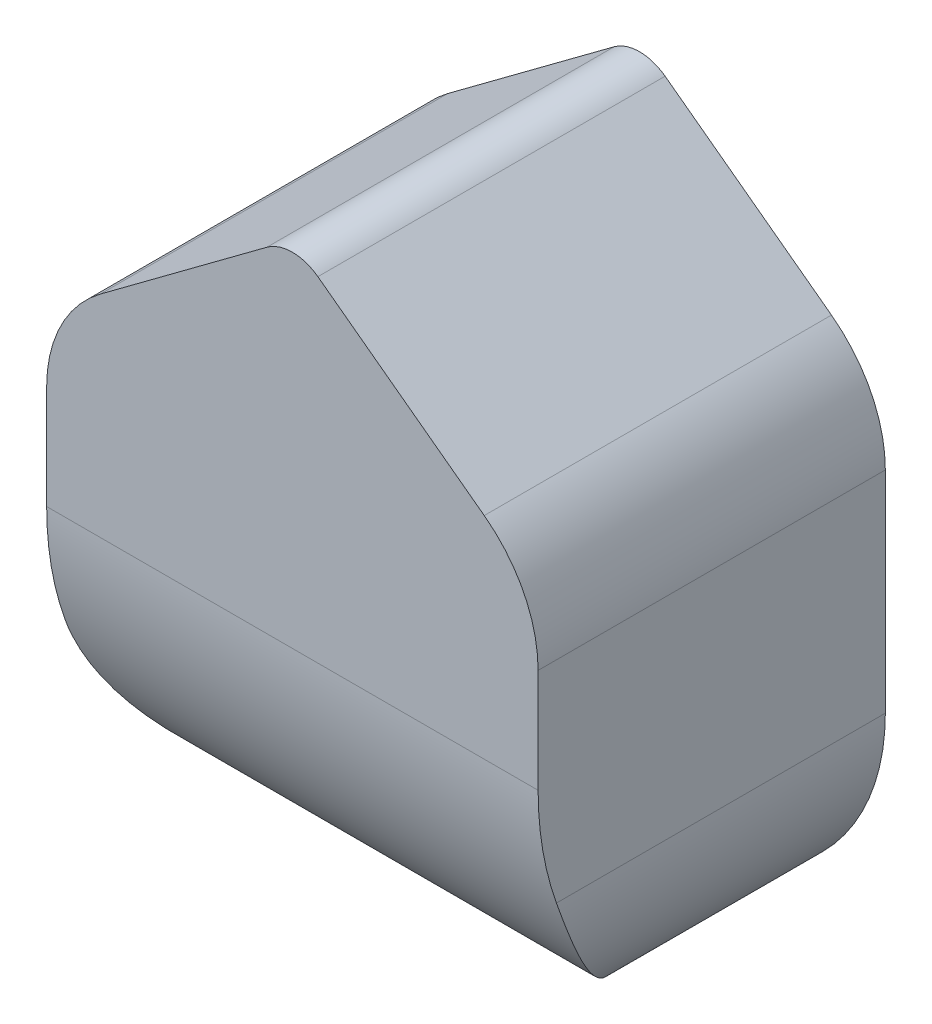
ISO-10303-21;
HEADER;
FILE_DESCRIPTION(('STEP AP214'),'2;1');
FILE_NAME('part.step','',(''),(''),'','','');
FILE_SCHEMA(('AUTOMOTIVE_DESIGN { 1 0 10303 214 1 1 1 1 }'));
ENDSEC;
DATA;
#1=APPLICATION_CONTEXT('core data for automotive mechanical design processes');
#2=APPLICATION_PROTOCOL_DEFINITION('international standard','automotive_design',2000,#1);
#3=PRODUCT_CONTEXT('',#1,'mechanical');
#4=PRODUCT('Part','Part','',(#3));
#5=PRODUCT_RELATED_PRODUCT_CATEGORY('part','',(#4));
#6=PRODUCT_DEFINITION_FORMATION('','',#4);
#7=PRODUCT_DEFINITION_CONTEXT('part definition',#1,'design');
#8=PRODUCT_DEFINITION('design','',#6,#7);
#9=PRODUCT_DEFINITION_SHAPE('','',#8);
#10=(LENGTH_UNIT() NAMED_UNIT(*) SI_UNIT(.MILLI.,.METRE.));
#11=(NAMED_UNIT(*) PLANE_ANGLE_UNIT() SI_UNIT($,.RADIAN.));
#12=(NAMED_UNIT(*) SI_UNIT($,.STERADIAN.) SOLID_ANGLE_UNIT());
#13=UNCERTAINTY_MEASURE_WITH_UNIT(LENGTH_MEASURE(1.E-05),#10,'distance_accuracy_value','');
#14=(GEOMETRIC_REPRESENTATION_CONTEXT(3) GLOBAL_UNCERTAINTY_ASSIGNED_CONTEXT((#13)) GLOBAL_UNIT_ASSIGNED_CONTEXT((#10,
#11,#12)) REPRESENTATION_CONTEXT('',''));
#15=CARTESIAN_POINT('',(0.,0.,0.));
#16=DIRECTION('',(0.,0.,1.));
#17=DIRECTION('',(1.,0.,0.));
#18=AXIS2_PLACEMENT_3D('',#15,#16,#17);
#19=CARTESIAN_POINT('',(0.,15.0430072601773,8.));
#20=DIRECTION('',(0.,-1.,0.));
#21=DIRECTION('',(0.,0.,-1.));
#22=AXIS2_PLACEMENT_3D('',#19,#20,#21);
#23=PLANE('',#22);
#24=DIRECTION('',(-1.,0.,0.));
#25=VECTOR('',#24,1.);
#26=CARTESIAN_POINT('',(0.,15.0430072601773,8.));
#27=LINE('',#26,#25);
#28=CARTESIAN_POINT('',(6.92261617752476,15.0430072601773,8.));
#29=VERTEX_POINT('',#28);
#30=CARTESIAN_POINT('',(1.46020735493172,15.0430072601773,8.));
#31=VERTEX_POINT('',#30);
#32=EDGE_CURVE('E259',#29,#31,#27,.T.);
#33=ORIENTED_EDGE('',*,*,#32,.F.);
#34=DIRECTION('',(0.,0.,-1.));
#35=VECTOR('',#34,1.);
#36=CARTESIAN_POINT('',(6.92261617752476,15.0430072601773,8.));
#37=LINE('',#36,#35);
#38=CARTESIAN_POINT('',(6.92261617752476,15.0430072601773,0.));
#39=VERTEX_POINT('',#38);
#40=EDGE_CURVE('E225',#29,#39,#37,.T.);
#41=ORIENTED_EDGE('',*,*,#40,.T.);
#42=DIRECTION('',(-1.,0.,0.));
#43=VECTOR('',#42,1.);
#44=CARTESIAN_POINT('',(0.,15.0430072601773,0.));
#45=LINE('',#44,#43);
#46=CARTESIAN_POINT('',(1.46020735493172,15.0430072601773,0.));
#47=VERTEX_POINT('',#46);
#48=EDGE_CURVE('E275',#39,#47,#45,.T.);
#49=ORIENTED_EDGE('',*,*,#48,.T.);
#50=DIRECTION('',(0.,0.,-1.));
#51=VECTOR('',#50,1.);
#52=CARTESIAN_POINT('',(1.46020735493172,15.0430072601773,8.));
#53=LINE('',#52,#51);
#54=EDGE_CURVE('E295',#31,#47,#53,.T.);
#55=ORIENTED_EDGE('',*,*,#54,.F.);
#56=EDGE_LOOP('',(#33,#41,#49,#55));
#57=FACE_BOUND('',#56,.T.);
#58=ADVANCED_FACE('F33',(#57),#23,.F.);
#59=CARTESIAN_POINT('',(9.2,7.64,8.));
#60=DIRECTION('',(0.,0.,-1.));
#61=DIRECTION('',(-1.,0.,0.));
#62=AXIS2_PLACEMENT_3D('',#59,#60,#61);
#63=CYLINDRICAL_SURFACE('',#62,4.71680323764082);
#64=CARTESIAN_POINT('',(9.2,7.64,0.));
#65=DIRECTION('',(0.,0.,-1.));
#66=DIRECTION('',(-1.,0.,0.));
#67=AXIS2_PLACEMENT_3D('',#64,#65,#66);
#68=CIRCLE('',#67,4.71680323764082);
#69=CARTESIAN_POINT('',(4.7810325419261,9.28953308154244,0.));
#70=VERTEX_POINT('',#69);
#71=CARTESIAN_POINT('',(6.92261617752476,11.7705878162493,0.));
#72=VERTEX_POINT('',#71);
#73=EDGE_CURVE('E237',#70,#72,#68,.T.);
#74=ORIENTED_EDGE('',*,*,#73,.T.);
#75=DIRECTION('',(0.,0.,-1.));
#76=VECTOR('',#75,1.);
#77=CARTESIAN_POINT('',(6.92261617752476,11.7705878162493,8.));
#78=LINE('',#77,#76);
#79=CARTESIAN_POINT('',(6.92261617752476,11.7705878162493,8.));
#80=VERTEX_POINT('',#79);
#81=EDGE_CURVE('E222',#80,#72,#78,.T.);
#82=ORIENTED_EDGE('',*,*,#81,.F.);
#83=CARTESIAN_POINT('',(9.2,7.64,8.));
#84=DIRECTION('',(0.,0.,-1.));
#85=DIRECTION('',(-1.,0.,0.));
#86=AXIS2_PLACEMENT_3D('',#83,#84,#85);
#87=CIRCLE('',#86,4.71680323764082);
#88=CARTESIAN_POINT('',(4.7810325419261,9.28953308154244,8.));
#89=VERTEX_POINT('',#88);
#90=EDGE_CURVE('E234',#89,#80,#87,.T.);
#91=ORIENTED_EDGE('',*,*,#90,.F.);
#92=DIRECTION('',(0.,0.,-1.));
#93=VECTOR('',#92,1.);
#94=CARTESIAN_POINT('',(4.7810325419261,9.28953308154244,8.));
#95=LINE('',#94,#93);
#96=EDGE_CURVE('E247',#89,#70,#95,.T.);
#97=ORIENTED_EDGE('',*,*,#96,.T.);
#98=EDGE_LOOP('',(#74,#82,#91,#97));
#99=FACE_BOUND('',#98,.T.);
#100=ADVANCED_FACE('F233',(#99),#63,.F.);
#101=CARTESIAN_POINT('',(0.,9.28953308154244,8.));
#102=DIRECTION('',(0.,-1.,0.));
#103=DIRECTION('',(0.,0.,-1.));
#104=AXIS2_PLACEMENT_3D('',#101,#102,#103);
#105=PLANE('',#104);
#106=ORIENTED_EDGE('',*,*,#96,.F.);
#107=DIRECTION('',(-1.,0.,0.));
#108=VECTOR('',#107,1.);
#109=CARTESIAN_POINT('',(0.,9.28953308154244,8.));
#110=LINE('',#109,#108);
#111=CARTESIAN_POINT('',(1.46020735493172,9.28953308154244,8.));
#112=VERTEX_POINT('',#111);
#113=EDGE_CURVE('E244',#89,#112,#110,.T.);
#114=ORIENTED_EDGE('',*,*,#113,.T.);
#115=DIRECTION('',(0.,0.,-1.));
#116=VECTOR('',#115,1.);
#117=CARTESIAN_POINT('',(1.46020735493172,9.28953308154244,8.));
#118=LINE('',#117,#116);
#119=CARTESIAN_POINT('',(1.46020735493172,9.28953308154244,0.));
#120=VERTEX_POINT('',#119);
#121=EDGE_CURVE('E276',#112,#120,#118,.T.);
#122=ORIENTED_EDGE('',*,*,#121,.T.);
#123=DIRECTION('',(-1.,0.,0.));
#124=VECTOR('',#123,1.);
#125=CARTESIAN_POINT('',(0.,9.28953308154244,0.));
#126=LINE('',#125,#124);
#127=EDGE_CURVE('E255',#70,#120,#126,.T.);
#128=ORIENTED_EDGE('',*,*,#127,.F.);
#129=EDGE_LOOP('',(#106,#114,#122,#128));
#130=FACE_BOUND('',#129,.T.);
#131=ADVANCED_FACE('F509',(#130),#105,.T.);
#132=CARTESIAN_POINT('',(13.4,15.886901908671,0.));
#133=DIRECTION('',(0.,0.,1.));
#134=DIRECTION('',(1.,0.,0.));
#135=AXIS2_PLACEMENT_3D('',#132,#133,#134);
#136=PLANE('',#135);
#137=CARTESIAN_POINT('',(13.4,15.886901908671,0.));
#138=DIRECTION('',(0.,0.,1.));
#139=DIRECTION('',(1.,0.,0.));
#140=AXIS2_PLACEMENT_3D('',#137,#138,#139);
#141=CIRCLE('',#140,5.);
#142=CARTESIAN_POINT('',(18.4,15.886901908671,0.));
#143=VERTEX_POINT('',#142);
#144=CARTESIAN_POINT('',(16.3832257694935,19.8994277974635,0.));
#145=VERTEX_POINT('',#144);
#146=EDGE_CURVE('E342',#143,#145,#141,.T.);
#147=ORIENTED_EDGE('',*,*,#146,.F.);
#148=DIRECTION('',(0.,1.,0.));
#149=VECTOR('',#148,1.);
#150=CARTESIAN_POINT('',(18.4,8.00000000000006,0.));
#151=LINE('',#150,#149);
#152=CARTESIAN_POINT('',(18.4,8.00000000000006,0.));
#153=VERTEX_POINT('',#152);
#154=EDGE_CURVE('E347',#153,#143,#151,.T.);
#155=ORIENTED_EDGE('',*,*,#154,.F.);
#156=CARTESIAN_POINT('',(10.4,8.,0.));
#157=DIRECTION('',(0.,0.,1.));
#158=DIRECTION('',(1.,0.,0.));
#159=AXIS2_PLACEMENT_3D('',#156,#157,#158);
#160=CIRCLE('',#159,8.);
#161=CARTESIAN_POINT('',(10.3999999999999,0.,0.));
#162=VERTEX_POINT('',#161);
#163=EDGE_CURVE('E380',#162,#153,#160,.T.);
#164=ORIENTED_EDGE('',*,*,#163,.F.);
#165=DIRECTION('',(1.,0.,0.));
#166=VECTOR('',#165,1.);
#167=CARTESIAN_POINT('',(8.00000000000006,0.,0.));
#168=LINE('',#167,#166);
#169=CARTESIAN_POINT('',(8.00000000000006,0.,0.));
#170=VERTEX_POINT('',#169);
#171=EDGE_CURVE('E377',#170,#162,#168,.T.);
#172=ORIENTED_EDGE('',*,*,#171,.F.);
#173=CARTESIAN_POINT('',(8.,8.,0.));
#174=DIRECTION('',(0.,0.,1.));
#175=DIRECTION('',(-1.,0.,0.));
#176=AXIS2_PLACEMENT_3D('',#173,#174,#175);
#177=CIRCLE('',#176,8.);
#178=CARTESIAN_POINT('',(0.,8.,0.));
#179=VERTEX_POINT('',#178);
#180=EDGE_CURVE('E374',#179,#170,#177,.T.);
#181=ORIENTED_EDGE('',*,*,#180,.F.);
#182=DIRECTION('',(0.,-1.,0.));
#183=VECTOR('',#182,1.);
#184=CARTESIAN_POINT('',(0.,15.886901908671,0.));
#185=LINE('',#184,#183);
#186=CARTESIAN_POINT('',(0.,15.886901908671,0.));
#187=VERTEX_POINT('',#186);
#188=EDGE_CURVE('E371',#187,#179,#185,.T.);
#189=ORIENTED_EDGE('',*,*,#188,.F.);
#190=CARTESIAN_POINT('',(5.,15.886901908671,0.));
#191=DIRECTION('',(0.,0.,1.));
#192=DIRECTION('',(-1.,0.,0.));
#193=AXIS2_PLACEMENT_3D('',#190,#191,#192);
#194=CIRCLE('',#193,5.);
#195=CARTESIAN_POINT('',(2.01677423050649,19.8994277974635,0.));
#196=VERTEX_POINT('',#195);
#197=EDGE_CURVE('E369',#196,#187,#194,.T.);
#198=ORIENTED_EDGE('',*,*,#197,.F.);
#199=DIRECTION('',(-0.802505177758493,-0.596645153898706,0.));
#200=VECTOR('',#199,1.);
#201=CARTESIAN_POINT('',(2.01677423050649,19.8994277974635,0.));
#202=LINE('',#201,#200);
#203=CARTESIAN_POINT('',(8.24536775376207,24.530251677797,0.));
#204=VERTEX_POINT('',#203);
#205=EDGE_CURVE('E367',#204,#196,#202,.T.);
#206=ORIENTED_EDGE('',*,*,#205,.F.);
#207=CARTESIAN_POINT('',(9.2,23.2462433933834,0.));
#208=DIRECTION('',(0.,0.,1.));
#209=DIRECTION('',(-1.,0.,0.));
#210=AXIS2_PLACEMENT_3D('',#207,#208,#209);
#211=CIRCLE('',#210,1.6);
#212=CARTESIAN_POINT('',(10.1546322462379,24.530251677797,0.));
#213=VERTEX_POINT('',#212);
#214=EDGE_CURVE('E365',#213,#204,#211,.T.);
#215=ORIENTED_EDGE('',*,*,#214,.F.);
#216=DIRECTION('',(-0.802505177758493,0.596645153898706,0.));
#217=VECTOR('',#216,1.);
#218=CARTESIAN_POINT('',(10.1546322462379,24.530251677797,0.));
#219=LINE('',#218,#217);
#220=EDGE_CURVE('E363',#145,#213,#219,.T.);
#221=ORIENTED_EDGE('',*,*,#220,.F.);
#222=EDGE_LOOP('',(#147,#155,#164,#172,#181,#189,#198,#206,#215,#221));
#223=FACE_BOUND('',#222,.T.);
#224=ORIENTED_EDGE('',*,*,#48,.F.);
#225=DIRECTION('',(0.,1.,0.));
#226=VECTOR('',#225,1.);
#227=CARTESIAN_POINT('',(6.92261617752476,15.3841818994494,0.));
#228=LINE('',#227,#226);
#229=EDGE_CURVE('E532',#72,#39,#228,.T.);
#230=ORIENTED_EDGE('',*,*,#229,.F.);
#231=ORIENTED_EDGE('',*,*,#73,.F.);
#232=ORIENTED_EDGE('',*,*,#127,.T.);
#233=DIRECTION('',(0.,1.,0.));
#234=VECTOR('',#233,1.);
#235=CARTESIAN_POINT('',(1.46020735493172,0.,0.));
#236=LINE('',#235,#234);
#237=CARTESIAN_POINT('',(1.46020735493172,5.21415553834277,0.));
#238=VERTEX_POINT('',#237);
#239=EDGE_CURVE('E325',#238,#120,#236,.T.);
#240=ORIENTED_EDGE('',*,*,#239,.F.);
#241=DIRECTION('',(-0.873427097958087,0.486954930719995,0.));
#242=VECTOR('',#241,1.);
#243=CARTESIAN_POINT('',(2.56393453633565,4.59880321596713,0.));
#244=LINE('',#243,#242);
#245=CARTESIAN_POINT('',(9.2,0.899049904366653,0.));
#246=VERTEX_POINT('',#245);
#247=EDGE_CURVE('E322',#246,#238,#244,.T.);
#248=ORIENTED_EDGE('',*,*,#247,.F.);
#249=DIRECTION('',(-0.873427097958086,-0.486954930719995,0.));
#250=VECTOR('',#249,1.);
#251=CARTESIAN_POINT('',(1.79916738743063,-3.22707801237557,0.));
#252=LINE('',#251,#250);
#253=CARTESIAN_POINT('',(16.9397926450683,5.21415553834277,0.));
#254=VERTEX_POINT('',#253);
#255=EDGE_CURVE('E319',#254,#246,#252,.T.);
#256=ORIENTED_EDGE('',*,*,#255,.F.);
#257=DIRECTION('',(0.,-1.,0.));
#258=VECTOR('',#257,1.);
#259=CARTESIAN_POINT('',(16.9397926450683,0.,0.));
#260=LINE('',#259,#258);
#261=CARTESIAN_POINT('',(16.9397926450683,9.28953308154244,0.));
#262=VERTEX_POINT('',#261);
#263=EDGE_CURVE('E316',#262,#254,#260,.T.);
#264=ORIENTED_EDGE('',*,*,#263,.F.);
#265=CARTESIAN_POINT('',(13.6189674580739,9.28953308154244,0.));
#266=VERTEX_POINT('',#265);
#267=EDGE_CURVE('E313',#262,#266,#126,.T.);
#268=ORIENTED_EDGE('',*,*,#267,.T.);
#269=CARTESIAN_POINT('',(11.4773838224752,11.7705878162493,0.));
#270=VERTEX_POINT('',#269);
#271=EDGE_CURVE('E252',#270,#266,#68,.T.);
#272=ORIENTED_EDGE('',*,*,#271,.F.);
#273=DIRECTION('',(0.,-1.,0.));
#274=VECTOR('',#273,1.);
#275=CARTESIAN_POINT('',(11.4773838224752,15.3841818994494,0.));
#276=LINE('',#275,#274);
#277=CARTESIAN_POINT('',(11.4773838224752,15.0430072601773,0.));
#278=VERTEX_POINT('',#277);
#279=EDGE_CURVE('E229',#278,#270,#276,.T.);
#280=ORIENTED_EDGE('',*,*,#279,.F.);
#281=CARTESIAN_POINT('',(16.9397926450683,15.0430072601773,0.));
#282=VERTEX_POINT('',#281);
#283=EDGE_CURVE('E277',#282,#278,#45,.T.);
#284=ORIENTED_EDGE('',*,*,#283,.F.);
#285=DIRECTION('',(0.,-1.,0.));
#286=VECTOR('',#285,1.);
#287=CARTESIAN_POINT('',(16.9397926450683,0.,0.));
#288=LINE('',#287,#286);
#289=CARTESIAN_POINT('',(16.9397926450683,18.1594724402711,0.));
#290=VERTEX_POINT('',#289);
#291=EDGE_CURVE('E273',#290,#282,#288,.T.);
#292=ORIENTED_EDGE('',*,*,#291,.F.);
#293=DIRECTION('',(0.83318290839071,-0.552997505569056,0.));
#294=VECTOR('',#293,1.);
#295=CARTESIAN_POINT('',(13.5472361944007,20.4111691995637,0.));
#296=LINE('',#295,#294);
#297=CARTESIAN_POINT('',(9.2,23.2965029569094,0.));
#298=VERTEX_POINT('',#297);
#299=EDGE_CURVE('E260',#298,#290,#296,.T.);
#300=ORIENTED_EDGE('',*,*,#299,.F.);
#301=DIRECTION('',(0.83318290839071,0.552997505569055,0.));
#302=VECTOR('',#301,1.);
#303=CARTESIAN_POINT('',(-7.92040135695373,11.9334047111436,0.));
#304=LINE('',#303,#302);
#305=CARTESIAN_POINT('',(1.46020735493172,18.1594724402711,0.));
#306=VERTEX_POINT('',#305);
#307=EDGE_CURVE('E283',#306,#298,#304,.T.);
#308=ORIENTED_EDGE('',*,*,#307,.F.);
#309=DIRECTION('',(0.,1.,0.));
#310=VECTOR('',#309,1.);
#311=CARTESIAN_POINT('',(1.46020735493172,0.,0.));
#312=LINE('',#311,#310);
#313=EDGE_CURVE('E280',#47,#306,#312,.T.);
#314=ORIENTED_EDGE('',*,*,#313,.F.);
#315=EDGE_LOOP('',(#224,#230,#231,#232,#240,#248,#256,#264,#268,#272,#280,#284,#292,#300,#308,#314));
#316=FACE_BOUND('',#315,.T.);
#317=ADVANCED_FACE('F469',(#223,#316),#136,.F.);
#318=CARTESIAN_POINT('',(13.4,12.,0.999999999999999));
#319=DIRECTION('',(-1.,0.,0.));
#320=DIRECTION('',(0.,0.,1.));
#321=AXIS2_PLACEMENT_3D('',#318,#319,#320);
#322=CYLINDRICAL_SURFACE('',#321,12.);
#323=CARTESIAN_POINT('',(-10.7112279493106,12.,0.999999999999999));
#324=DIRECTION('',(-0.486954930719995,-0.873427097958087,0.));
#325=DIRECTION('',(-0.873427097958086,0.486954930719995,0.));
#326=AXIS2_PLACEMENT_3D('',#323,#324,#325);
#327=ELLIPSE('',#326,24.6429376580235,12.);
#328=CARTESIAN_POINT('',(6.77111746280706,2.25320565519103,8.));
#329=VERTEX_POINT('',#328);
#330=CARTESIAN_POINT('',(9.2,0.899049904366653,5.55729162708049));
#331=VERTEX_POINT('',#330);
#332=EDGE_CURVE('E340',#329,#331,#327,.F.);
#333=ORIENTED_EDGE('',*,*,#332,.F.);
#334=DIRECTION('',(-1.,0.,0.));
#335=VECTOR('',#334,1.);
#336=CARTESIAN_POINT('',(13.4,2.25320565519103,8.));
#337=LINE('',#336,#335);
#338=CARTESIAN_POINT('',(11.6288825371929,2.25320565519103,8.));
#339=VERTEX_POINT('',#338);
#340=EDGE_CURVE('E11',#329,#339,#337,.F.);
#341=ORIENTED_EDGE('',*,*,#340,.T.);
#342=CARTESIAN_POINT('',(29.1112279493106,12.,0.999999999999999));
#343=DIRECTION('',(0.486954930719995,-0.873427097958086,0.));
#344=DIRECTION('',(-0.873427097958086,-0.486954930719995,0.));
#345=AXIS2_PLACEMENT_3D('',#342,#343,#344);
#346=ELLIPSE('',#345,24.6429376580235,12.);
#347=EDGE_CURVE('E290',#331,#339,#346,.F.);
#348=ORIENTED_EDGE('',*,*,#347,.F.);
#349=EDGE_LOOP('',(#333,#341,#348));
#350=FACE_BOUND('',#349,.T.);
#351=DIRECTION('',(1.,0.,0.));
#352=VECTOR('',#351,1.);
#353=CARTESIAN_POINT('',(13.4,12.,13.));
#354=LINE('',#353,#352);
#355=CARTESIAN_POINT('',(0.,12.,13.));
#356=VERTEX_POINT('',#355);
#357=CARTESIAN_POINT('',(18.4,12.,13.));
#358=VERTEX_POINT('',#357);
#359=EDGE_CURVE('E409',#356,#358,#354,.T.);
#360=ORIENTED_EDGE('',*,*,#359,.F.);
#361=CARTESIAN_POINT('',(0.,12.,0.999999999999999));
#362=DIRECTION('',(1.,0.,0.));
#363=DIRECTION('',(0.,1.,0.));
#364=AXIS2_PLACEMENT_3D('',#361,#362,#363);
#365=CIRCLE('',#364,12.);
#366=CARTESIAN_POINT('',(0.,8.,12.3137084989848));
#367=VERTEX_POINT('',#366);
#368=EDGE_CURVE('E42',#367,#356,#365,.F.);
#369=ORIENTED_EDGE('',*,*,#368,.F.);
#370=CARTESIAN_POINT('',(8.,0.,0.999999999999994));
#371=CARTESIAN_POINT('',(7.99538122695561,2.50438115082193E-09,1.0056568188216));
#372=CARTESIAN_POINT('',(7.99076242370517,4.00238210075459E-06,1.0113136744086));
#373=CARTESIAN_POINT('',(7.63845723717338,0.000614028153834457,1.44279779003448));
#374=CARTESIAN_POINT('',(7.2906242555845,0.0238691152832424,1.8688154183229));
#375=CARTESIAN_POINT('',(6.59807150362606,0.116042783644326,2.71888550356705));
#376=CARTESIAN_POINT('',(6.25335456063913,0.184999296468617,3.14293603319878));
#377=CARTESIAN_POINT('',(5.57006293517,0.369737381878923,3.98732989502775));
#378=CARTESIAN_POINT('',(5.23150223962011,0.485614327151301,4.40766388385967));
#379=CARTESIAN_POINT('',(4.56552401194781,0.765720759717765,5.24075064228316));
#380=CARTESIAN_POINT('',(4.23809973587422,0.929920380658537,5.65350792782798));
#381=CARTESIAN_POINT('',(3.70249967635173,1.24761725551014,6.3365471084129));
#382=CARTESIAN_POINT('',(3.48995335260782,1.38745416110487,6.60980366210154));
#383=CARTESIAN_POINT('',(3.07411657147563,1.69112085546111,7.15004228345396));
#384=CARTESIAN_POINT('',(2.87082591770061,1.85495013484128,7.41702448418871));
#385=CARTESIAN_POINT('',(2.47617755647125,2.20714111952762,7.9426085624446));
#386=CARTESIAN_POINT('',(2.28479888573817,2.39545781564837,8.20122475398117));
#387=CARTESIAN_POINT('',(1.9163868656873,2.79769332155627,8.70858530127832));
#388=CARTESIAN_POINT('',(1.73934929430897,3.01160454996406,8.95733255139909));
#389=CARTESIAN_POINT('',(1.44670970620311,3.4067303757682,9.37951219638362));
#390=CARTESIAN_POINT('',(1.32709246285545,3.58201065578788,9.55572830009674));
#391=CARTESIAN_POINT('',(1.0992154588197,3.94716392022832,9.90027095100729));
#392=CARTESIAN_POINT('',(0.99095517928543,4.13703623732041,10.0685978584304));
#393=CARTESIAN_POINT('',(0.787763737007561,4.53117241458256,10.3958591903217));
#394=CARTESIAN_POINT('',(0.69282126448605,4.73542383955199,10.5548015171331));
#395=CARTESIAN_POINT('',(0.518289080259518,5.15812524534969,10.8618934282103));
#396=CARTESIAN_POINT('',(0.438695909231553,5.37657201205416,11.01004543963));
#397=CARTESIAN_POINT('',(0.311845063608718,5.78024865969523,11.2644649948438));
#398=CARTESIAN_POINT('',(0.26130448519226,5.96298905317116,11.3730527042074));
#399=CARTESIAN_POINT('',(0.172562033916395,6.33626933695993,11.5814848900598));
#400=CARTESIAN_POINT('',(0.134357364362326,6.52680744838642,11.6813313445465));
#401=CARTESIAN_POINT('',(0.0715560402377211,6.91451540789029,11.8712633276666));
#402=CARTESIAN_POINT('',(0.0469383402883149,7.11167449505038,11.9613637772016));
#403=CARTESIAN_POINT('',(0.0124013140751022,7.51160920753289,12.1311053355569));
#404=CARTESIAN_POINT('',(0.0024745807025733,7.71438194990565,12.2107516968008));
#405=CARTESIAN_POINT('',(-0.00166698657798628,8.12486108069892,12.3591850818682));
#406=CARTESIAN_POINT('',(0.00417391925332744,8.33258239209948,12.4279326690026));
#407=CARTESIAN_POINT('',(0.0325209001306191,8.75041701699626,12.553692661359));
#408=CARTESIAN_POINT('',(0.0550257408966633,8.96053015219777,12.6107059353295));
#409=CARTESIAN_POINT('',(0.117538329136434,9.38303014447101,12.7132022489421));
#410=CARTESIAN_POINT('',(0.157699321897933,9.59542065832897,12.758578701998));
#411=CARTESIAN_POINT('',(0.231232940287547,9.91260907318874,12.8175465704628));
#412=CARTESIAN_POINT('',(0.257974628378074,10.01815313702,12.8356925461555));
#413=CARTESIAN_POINT('',(0.315880924422312,10.2285005449097,12.8689987915752));
#414=CARTESIAN_POINT('',(0.347045687367239,10.3333038628761,12.8841589566305));
#415=CARTESIAN_POINT('',(0.380416845387935,10.4376120589528,12.8978545932311));
#416=B_SPLINE_CURVE_WITH_KNOTS('',3,(#370,#371,#372,#373,#374,#375,#376,#377,#378,#379,#380,
#381,#382,#383,#384,#385,#386,#387,#388,#389,#390,#391,#392,#393,#394,#395,#396,#397,#398,#399,
#400,#401,#402,#403,#404,#405,#406,#407,#408,#409,#410,#411,#412,#413,#414,#415),.UNSPECIFIED.,
.F.,.F.,(4,2,2,2,2,2,2,2,2,2,2,2,2,2,2,2,2,2,2,2,2,2,4),(0.,0.0219089055865456,1.67112072310379,
3.32170308220163,4.97565747124117,6.62859175506892,7.74786350337341,8.86711149189854,
9.98433057801761,11.1012195471463,11.9280726176783,12.7548878967222,13.5809967189719,
14.4069191401942,15.0618012045276,15.7165346950303,16.3702511769761,17.0236379460579,
17.6793375063007,18.3349885044322,18.9964461230666,19.3274749204774,19.658515320502),.UNSPECIFIED.);
#417=CARTESIAN_POINT('',(8.00000000000006,0.,0.999999999999997));
#418=VERTEX_POINT('',#417);
#419=EDGE_CURVE('E444',#418,#367,#416,.T.);
#420=ORIENTED_EDGE('',*,*,#419,.F.);
#421=DIRECTION('',(1.,0.,0.));
#422=VECTOR('',#421,1.);
#423=CARTESIAN_POINT('',(13.4,0.,0.999999999999999));
#424=LINE('',#423,#422);
#425=CARTESIAN_POINT('',(10.3999999999999,0.,1.));
#426=VERTEX_POINT('',#425);
#427=EDGE_CURVE('E423',#426,#418,#424,.F.);
#428=ORIENTED_EDGE('',*,*,#427,.F.);
#429=CARTESIAN_POINT('',(18.4,8.00000000000006,12.3137084989848));
#430=CARTESIAN_POINT('',(18.4000010529958,7.88725152338777,12.2738482261777));
#431=CARTESIAN_POINT('',(18.3976161135973,7.77512277413698,12.2323058091683));
#432=CARTESIAN_POINT('',(18.3882430818392,7.55234039805637,12.1459672469286));
#433=CARTESIAN_POINT('',(18.3812557668838,7.44168652531964,12.1011716523414));
#434=CARTESIAN_POINT('',(18.3536742397118,7.11261636595452,11.9622113884956));
#435=CARTESIAN_POINT('',(18.3264592487976,6.8966972807025,11.8633336459753));
#436=CARTESIAN_POINT('',(18.2562585906298,6.47540971948012,11.655214055401));
#437=CARTESIAN_POINT('',(18.2134346367928,6.26995683980785,11.5460867088325));
#438=CARTESIAN_POINT('',(18.1135305601132,5.86826225009446,11.3177133684775));
#439=CARTESIAN_POINT('',(18.0564437205449,5.67202493174679,11.1984626248652));
#440=CARTESIAN_POINT('',(17.9150978010627,5.24600374773862,10.9227874906646));
#441=CARTESIAN_POINT('',(17.8276112806537,5.01876140446632,10.7640832381));
#442=CARTESIAN_POINT('',(17.6361915951927,4.58023201617734,10.4351617868805));
#443=CARTESIAN_POINT('',(17.5322562836741,4.36894705882479,10.2649430873229));
#444=CARTESIAN_POINT('',(17.198489934502,3.75776199036091,9.73815040519433));
#445=CARTESIAN_POINT('',(16.9472687447155,3.38215514204372,9.36651052348747));
#446=CARTESIAN_POINT('',(16.4877384121156,2.80079723623293,8.71383310490017));
#447=CARTESIAN_POINT('',(16.2898316257542,2.57824609813858,8.43988258724113));
#448=CARTESIAN_POINT('',(15.8783654588827,2.16279768949804,7.88117203577637));
#449=CARTESIAN_POINT('',(15.6648003264538,1.96991139741359,7.5964080484682));
#450=CARTESIAN_POINT('',(15.2252210813791,1.61270288172112,7.01828023825002));
#451=CARTESIAN_POINT('',(14.9991948017193,1.44840925037398,6.72490814596327));
#452=CARTESIAN_POINT('',(14.5375568913225,1.14751786646914,6.13168726958051));
#453=CARTESIAN_POINT('',(14.3019458966282,1.01091827972,5.83183891586721));
#454=CARTESIAN_POINT('',(13.7719853856738,0.738002333745983,5.16229130680892));
#455=CARTESIAN_POINT('',(13.4758729476844,0.60802610183671,4.79139953569769));
#456=CARTESIAN_POINT('',(12.8759417359698,0.386063271920366,4.04439422001096));
#457=CARTESIAN_POINT('',(12.5721203988501,0.294089491123075,3.66827895782721));
#458=CARTESIAN_POINT('',(11.9603117448215,0.147345320717247,2.91364279033773));
#459=CARTESIAN_POINT('',(11.65233483902,0.0924950339377045,2.53512883240664));
#460=CARTESIAN_POINT('',(11.0341558093933,0.0191081585270254,1.77668822016056));
#461=CARTESIAN_POINT('',(10.7239551905412,0.000548979871861872,1.39676259223756));
#462=CARTESIAN_POINT('',(10.4092375795799,4.0018575963251E-06,1.01131367837152));
#463=CARTESIAN_POINT('',(10.4046187763309,1.96604067198943E-09,1.00565682278493));
#464=CARTESIAN_POINT('',(10.4,0.,0.999999999999994));
#465=B_SPLINE_CURVE_WITH_KNOTS('',3,(#429,#430,#431,#432,#433,#434,#435,#436,#437,#438,#439,
#440,#441,#442,#443,#444,#445,#446,#447,#448,#449,#450,#451,#452,#453,#454,#455,#456,#457,#458,
#459,#460,#461,#462,#463,#464),.UNSPECIFIED.,.F.,.F.,(4,2,2,2,2,2,2,2,2,2,2,2,2,2,2,2,2,4),(0.,
0.358680711212579,0.717300851873326,1.43329167302744,2.14206619375366,2.8511751241552,
3.72182051738215,4.59257961832493,6.34010279388976,7.55272473642902,8.76579437566227,
9.98007018319371,11.1942655422957,12.6687901822852,14.1438117348278,15.6156485649524,
17.0865689329334,17.10847783852),.UNSPECIFIED.);
#466=CARTESIAN_POINT('',(18.4,8.00000000000006,12.3137084989848));
#467=VERTEX_POINT('',#466);
#468=EDGE_CURVE('E415',#467,#426,#465,.T.);
#469=ORIENTED_EDGE('',*,*,#468,.F.);
#470=CARTESIAN_POINT('',(18.4,12.,0.999999999999999));
#471=DIRECTION('',(-1.,0.,0.));
#472=DIRECTION('',(0.,0.,1.));
#473=AXIS2_PLACEMENT_3D('',#470,#471,#472);
#474=CIRCLE('',#473,12.);
#475=EDGE_CURVE('E412',#358,#467,#474,.F.);
#476=ORIENTED_EDGE('',*,*,#475,.F.);
#477=EDGE_LOOP('',(#360,#369,#420,#428,#469,#476));
#478=FACE_BOUND('',#477,.T.);
#479=ADVANCED_FACE('F35',(#350,#478),#322,.T.);
#480=CARTESIAN_POINT('',(13.4,15.886901908671,13.));
#481=DIRECTION('',(0.,0.,-1.));
#482=DIRECTION('',(-1.,0.,0.));
#483=AXIS2_PLACEMENT_3D('',#480,#481,#482);
#484=CYLINDRICAL_SURFACE('',#483,5.);
#485=ORIENTED_EDGE('',*,*,#146,.T.);
#486=DIRECTION('',(0.,0.,-1.));
#487=VECTOR('',#486,1.);
#488=CARTESIAN_POINT('',(16.3832257694935,19.8994277974635,13.));
#489=LINE('',#488,#487);
#490=CARTESIAN_POINT('',(16.3832257694935,19.8994277974635,13.));
#491=VERTEX_POINT('',#490);
#492=EDGE_CURVE('E406',#491,#145,#489,.T.);
#493=ORIENTED_EDGE('',*,*,#492,.F.);
#494=CARTESIAN_POINT('',(13.4,15.886901908671,13.));
#495=DIRECTION('',(0.,0.,1.));
#496=DIRECTION('',(1.,0.,0.));
#497=AXIS2_PLACEMENT_3D('',#494,#495,#496);
#498=CIRCLE('',#497,5.);
#499=CARTESIAN_POINT('',(18.4,15.886901908671,13.));
#500=VERTEX_POINT('',#499);
#501=EDGE_CURVE('E343',#500,#491,#498,.T.);
#502=ORIENTED_EDGE('',*,*,#501,.F.);
#503=DIRECTION('',(0.,0.,-1.));
#504=VECTOR('',#503,1.);
#505=CARTESIAN_POINT('',(18.4,15.886901908671,13.));
#506=LINE('',#505,#504);
#507=EDGE_CURVE('E360',#500,#143,#506,.T.);
#508=ORIENTED_EDGE('',*,*,#507,.T.);
#509=EDGE_LOOP('',(#485,#493,#502,#508));
#510=FACE_BOUND('',#509,.T.);
#511=ADVANCED_FACE('F485',(#510),#484,.T.);
#512=CARTESIAN_POINT('',(10.1546322462379,24.530251677797,13.));
#513=DIRECTION('',(-0.596645153898706,-0.802505177758492,0.));
#514=DIRECTION('',(0.802505177758493,-0.596645153898706,0.));
#515=AXIS2_PLACEMENT_3D('',#512,#513,#514);
#516=PLANE('',#515);
#517=ORIENTED_EDGE('',*,*,#220,.T.);
#518=DIRECTION('',(0.,0.,-1.));
#519=VECTOR('',#518,1.);
#520=CARTESIAN_POINT('',(10.1546322462379,24.530251677797,13.));
#521=LINE('',#520,#519);
#522=CARTESIAN_POINT('',(10.1546322462379,24.530251677797,13.));
#523=VERTEX_POINT('',#522);
#524=EDGE_CURVE('E403',#523,#213,#521,.T.);
#525=ORIENTED_EDGE('',*,*,#524,.F.);
#526=DIRECTION('',(-0.802505177758493,0.596645153898706,0.));
#527=VECTOR('',#526,1.);
#528=CARTESIAN_POINT('',(10.1546322462379,24.530251677797,13.));
#529=LINE('',#528,#527);
#530=EDGE_CURVE('E346',#491,#523,#529,.T.);
#531=ORIENTED_EDGE('',*,*,#530,.F.);
#532=ORIENTED_EDGE('',*,*,#492,.T.);
#533=EDGE_LOOP('',(#517,#525,#531,#532));
#534=FACE_BOUND('',#533,.T.);
#535=ADVANCED_FACE('F487',(#534),#516,.F.);
#536=CARTESIAN_POINT('',(9.2,23.2462433933834,13.));
#537=DIRECTION('',(0.,0.,-1.));
#538=DIRECTION('',(-1.,0.,0.));
#539=AXIS2_PLACEMENT_3D('',#536,#537,#538);
#540=CYLINDRICAL_SURFACE('',#539,1.6);
#541=ORIENTED_EDGE('',*,*,#214,.T.);
#542=DIRECTION('',(0.,0.,-1.));
#543=VECTOR('',#542,1.);
#544=CARTESIAN_POINT('',(8.24536775376207,24.530251677797,13.));
#545=LINE('',#544,#543);
#546=CARTESIAN_POINT('',(8.24536775376207,24.530251677797,13.));
#547=VERTEX_POINT('',#546);
#548=EDGE_CURVE('E400',#547,#204,#545,.T.);
#549=ORIENTED_EDGE('',*,*,#548,.F.);
#550=CARTESIAN_POINT('',(9.2,23.2462433933834,13.));
#551=DIRECTION('',(0.,0.,1.));
#552=DIRECTION('',(-1.,0.,0.));
#553=AXIS2_PLACEMENT_3D('',#550,#551,#552);
#554=CIRCLE('',#553,1.6);
#555=EDGE_CURVE('E349',#523,#547,#554,.T.);
#556=ORIENTED_EDGE('',*,*,#555,.F.);
#557=ORIENTED_EDGE('',*,*,#524,.T.);
#558=EDGE_LOOP('',(#541,#549,#556,#557));
#559=FACE_BOUND('',#558,.T.);
#560=ADVANCED_FACE('F492',(#559),#540,.T.);
#561=CARTESIAN_POINT('',(2.01677423050649,19.8994277974635,13.));
#562=DIRECTION('',(0.596645153898706,-0.802505177758493,0.));
#563=DIRECTION('',(0.802505177758493,0.596645153898706,0.));
#564=AXIS2_PLACEMENT_3D('',#561,#562,#563);
#565=PLANE('',#564);
#566=ORIENTED_EDGE('',*,*,#205,.T.);
#567=DIRECTION('',(0.,0.,-1.));
#568=VECTOR('',#567,1.);
#569=CARTESIAN_POINT('',(2.01677423050649,19.8994277974635,13.));
#570=LINE('',#569,#568);
#571=CARTESIAN_POINT('',(2.01677423050649,19.8994277974635,13.));
#572=VERTEX_POINT('',#571);
#573=EDGE_CURVE('E397',#572,#196,#570,.T.);
#574=ORIENTED_EDGE('',*,*,#573,.F.);
#575=DIRECTION('',(-0.802505177758493,-0.596645153898706,0.));
#576=VECTOR('',#575,1.);
#577=CARTESIAN_POINT('',(2.01677423050649,19.8994277974635,13.));
#578=LINE('',#577,#576);
#579=EDGE_CURVE('E351',#547,#572,#578,.T.);
#580=ORIENTED_EDGE('',*,*,#579,.F.);
#581=ORIENTED_EDGE('',*,*,#548,.T.);
#582=EDGE_LOOP('',(#566,#574,#580,#581));
#583=FACE_BOUND('',#582,.T.);
#584=ADVANCED_FACE('F494',(#583),#565,.F.);
#585=CARTESIAN_POINT('',(5.,15.886901908671,13.));
#586=DIRECTION('',(0.,0.,-1.));
#587=DIRECTION('',(-1.,0.,0.));
#588=AXIS2_PLACEMENT_3D('',#585,#586,#587);
#589=CYLINDRICAL_SURFACE('',#588,5.);
#590=ORIENTED_EDGE('',*,*,#197,.T.);
#591=DIRECTION('',(0.,0.,-1.));
#592=VECTOR('',#591,1.);
#593=CARTESIAN_POINT('',(0.,15.886901908671,13.));
#594=LINE('',#593,#592);
#595=CARTESIAN_POINT('',(0.,15.886901908671,13.));
#596=VERTEX_POINT('',#595);
#597=EDGE_CURVE('E394',#596,#187,#594,.T.);
#598=ORIENTED_EDGE('',*,*,#597,.F.);
#599=CARTESIAN_POINT('',(5.,15.886901908671,13.));
#600=DIRECTION('',(0.,0.,1.));
#601=DIRECTION('',(-1.,0.,0.));
#602=AXIS2_PLACEMENT_3D('',#599,#600,#601);
#603=CIRCLE('',#602,5.);
#604=EDGE_CURVE('E353',#572,#596,#603,.T.);
#605=ORIENTED_EDGE('',*,*,#604,.F.);
#606=ORIENTED_EDGE('',*,*,#573,.T.);
#607=EDGE_LOOP('',(#590,#598,#605,#606));
#608=FACE_BOUND('',#607,.T.);
#609=ADVANCED_FACE('F463',(#608),#589,.T.);
#610=CARTESIAN_POINT('',(0.,15.886901908671,13.));
#611=DIRECTION('',(1.,0.,0.));
#612=DIRECTION('',(0.,1.,0.));
#613=AXIS2_PLACEMENT_3D('',#610,#611,#612);
#614=PLANE('',#613);
#615=DIRECTION('',(0.,0.,-1.));
#616=VECTOR('',#615,1.);
#617=CARTESIAN_POINT('',(0.,8.,13.));
#618=LINE('',#617,#616);
#619=EDGE_CURVE('E392',#367,#179,#618,.T.);
#620=ORIENTED_EDGE('',*,*,#619,.F.);
#621=ORIENTED_EDGE('',*,*,#368,.T.);
#622=DIRECTION('',(0.,-1.,0.));
#623=VECTOR('',#622,1.);
#624=CARTESIAN_POINT('',(0.,15.886901908671,13.));
#625=LINE('',#624,#623);
#626=EDGE_CURVE('E355',#596,#356,#625,.T.);
#627=ORIENTED_EDGE('',*,*,#626,.F.);
#628=ORIENTED_EDGE('',*,*,#597,.T.);
#629=ORIENTED_EDGE('',*,*,#188,.T.);
#630=EDGE_LOOP('',(#620,#621,#627,#628,#629));
#631=FACE_BOUND('',#630,.T.);
#632=ADVANCED_FACE('F441',(#631),#614,.F.);
#633=CARTESIAN_POINT('',(8.,8.,13.));
#634=DIRECTION('',(0.,0.,-1.));
#635=DIRECTION('',(-1.,0.,0.));
#636=AXIS2_PLACEMENT_3D('',#633,#634,#635);
#637=CYLINDRICAL_SURFACE('',#636,8.);
#638=DIRECTION('',(0.,0.,-1.));
#639=VECTOR('',#638,1.);
#640=CARTESIAN_POINT('',(8.00000000000006,0.,13.));
#641=LINE('',#640,#639);
#642=EDGE_CURVE('E390',#418,#170,#641,.T.);
#643=ORIENTED_EDGE('',*,*,#642,.F.);
#644=ORIENTED_EDGE('',*,*,#419,.T.);
#645=ORIENTED_EDGE('',*,*,#619,.T.);
#646=ORIENTED_EDGE('',*,*,#180,.T.);
#647=EDGE_LOOP('',(#643,#644,#645,#646));
#648=FACE_BOUND('',#647,.T.);
#649=ADVANCED_FACE('F436',(#648),#637,.T.);
#650=CARTESIAN_POINT('',(8.00000000000006,0.,13.));
#651=DIRECTION('',(0.,1.,0.));
#652=DIRECTION('',(0.,0.,1.));
#653=AXIS2_PLACEMENT_3D('',#650,#651,#652);
#654=PLANE('',#653);
#655=DIRECTION('',(0.,0.,-1.));
#656=VECTOR('',#655,1.);
#657=CARTESIAN_POINT('',(10.3999999999999,0.,13.));
#658=LINE('',#657,#656);
#659=EDGE_CURVE('E388',#426,#162,#658,.T.);
#660=ORIENTED_EDGE('',*,*,#659,.F.);
#661=ORIENTED_EDGE('',*,*,#427,.T.);
#662=ORIENTED_EDGE('',*,*,#642,.T.);
#663=ORIENTED_EDGE('',*,*,#171,.T.);
#664=EDGE_LOOP('',(#660,#661,#662,#663));
#665=FACE_BOUND('',#664,.T.);
#666=ADVANCED_FACE('F431',(#665),#654,.F.);
#667=CARTESIAN_POINT('',(10.4,8.,13.));
#668=DIRECTION('',(0.,0.,-1.));
#669=DIRECTION('',(-1.,0.,0.));
#670=AXIS2_PLACEMENT_3D('',#667,#668,#669);
#671=CYLINDRICAL_SURFACE('',#670,8.);
#672=DIRECTION('',(0.,0.,-1.));
#673=VECTOR('',#672,1.);
#674=CARTESIAN_POINT('',(18.4,8.00000000000006,13.));
#675=LINE('',#674,#673);
#676=EDGE_CURVE('E386',#467,#153,#675,.T.);
#677=ORIENTED_EDGE('',*,*,#676,.F.);
#678=ORIENTED_EDGE('',*,*,#468,.T.);
#679=ORIENTED_EDGE('',*,*,#659,.T.);
#680=ORIENTED_EDGE('',*,*,#163,.T.);
#681=EDGE_LOOP('',(#677,#678,#679,#680));
#682=FACE_BOUND('',#681,.T.);
#683=ADVANCED_FACE('F425',(#682),#671,.T.);
#684=CARTESIAN_POINT('',(18.4,8.00000000000006,13.));
#685=DIRECTION('',(-1.,0.,0.));
#686=DIRECTION('',(0.,0.,1.));
#687=AXIS2_PLACEMENT_3D('',#684,#685,#686);
#688=PLANE('',#687);
#689=DIRECTION('',(0.,1.,0.));
#690=VECTOR('',#689,1.);
#691=CARTESIAN_POINT('',(18.4,8.00000000000006,13.));
#692=LINE('',#691,#690);
#693=EDGE_CURVE('E358',#358,#500,#692,.T.);
#694=ORIENTED_EDGE('',*,*,#693,.F.);
#695=ORIENTED_EDGE('',*,*,#475,.T.);
#696=ORIENTED_EDGE('',*,*,#676,.T.);
#697=ORIENTED_EDGE('',*,*,#154,.T.);
#698=ORIENTED_EDGE('',*,*,#507,.F.);
#699=EDGE_LOOP('',(#694,#695,#696,#697,#698));
#700=FACE_BOUND('',#699,.T.);
#701=ADVANCED_FACE('F430',(#700),#688,.F.);
#702=CARTESIAN_POINT('',(13.4,15.886901908671,13.));
#703=DIRECTION('',(0.,0.,1.));
#704=DIRECTION('',(1.,0.,0.));
#705=AXIS2_PLACEMENT_3D('',#702,#703,#704);
#706=PLANE('',#705);
#707=ORIENTED_EDGE('',*,*,#626,.T.);
#708=ORIENTED_EDGE('',*,*,#359,.T.);
#709=ORIENTED_EDGE('',*,*,#693,.T.);
#710=ORIENTED_EDGE('',*,*,#501,.T.);
#711=ORIENTED_EDGE('',*,*,#530,.T.);
#712=ORIENTED_EDGE('',*,*,#555,.T.);
#713=ORIENTED_EDGE('',*,*,#579,.T.);
#714=ORIENTED_EDGE('',*,*,#604,.T.);
#715=EDGE_LOOP('',(#707,#708,#709,#710,#711,#712,#713,#714));
#716=FACE_BOUND('',#715,.T.);
#717=ADVANCED_FACE('F457',(#716),#706,.T.);
#718=DIRECTION('',(0.,0.,-1.));
#719=VECTOR('',#718,1.);
#720=CARTESIAN_POINT('',(13.6189674580739,9.28953308154244,8.));
#721=LINE('',#720,#719);
#722=CARTESIAN_POINT('',(13.6189674580739,9.28953308154244,8.));
#723=VERTEX_POINT('',#722);
#724=EDGE_CURVE('E245',#266,#723,#721,.F.);
#725=ORIENTED_EDGE('',*,*,#724,.F.);
#726=ORIENTED_EDGE('',*,*,#267,.F.);
#727=DIRECTION('',(0.,0.,-1.));
#728=VECTOR('',#727,1.);
#729=CARTESIAN_POINT('',(16.9397926450683,9.28953308154244,8.));
#730=LINE('',#729,#728);
#731=CARTESIAN_POINT('',(16.9397926450683,9.28953308154244,8.));
#732=VERTEX_POINT('',#731);
#733=EDGE_CURVE('E312',#732,#262,#730,.T.);
#734=ORIENTED_EDGE('',*,*,#733,.F.);
#735=EDGE_CURVE('E300',#732,#723,#110,.T.);
#736=ORIENTED_EDGE('',*,*,#735,.T.);
#737=EDGE_LOOP('',(#725,#726,#734,#736));
#738=FACE_BOUND('',#737,.T.);
#739=ADVANCED_FACE('F540',(#738),#105,.T.);
#740=CARTESIAN_POINT('',(1.46020735493172,0.,8.));
#741=DIRECTION('',(-1.,0.,0.));
#742=DIRECTION('',(0.,0.,1.));
#743=AXIS2_PLACEMENT_3D('',#740,#741,#742);
#744=PLANE('',#743);
#745=ORIENTED_EDGE('',*,*,#239,.T.);
#746=ORIENTED_EDGE('',*,*,#121,.F.);
#747=DIRECTION('',(0.,1.,0.));
#748=VECTOR('',#747,1.);
#749=CARTESIAN_POINT('',(1.46020735493172,0.,8.));
#750=LINE('',#749,#748);
#751=CARTESIAN_POINT('',(1.46020735493172,5.21415553834277,8.));
#752=VERTEX_POINT('',#751);
#753=EDGE_CURVE('E310',#752,#112,#750,.T.);
#754=ORIENTED_EDGE('',*,*,#753,.F.);
#755=DIRECTION('',(0.,0.,-1.));
#756=VECTOR('',#755,1.);
#757=CARTESIAN_POINT('',(1.46020735493172,5.21415553834277,8.));
#758=LINE('',#757,#756);
#759=EDGE_CURVE('E330',#752,#238,#758,.T.);
#760=ORIENTED_EDGE('',*,*,#759,.T.);
#761=EDGE_LOOP('',(#745,#746,#754,#760));
#762=FACE_BOUND('',#761,.T.);
#763=ADVANCED_FACE('F561',(#762),#744,.F.);
#764=CARTESIAN_POINT('',(2.56393453633565,4.59880321596713,8.));
#765=DIRECTION('',(-0.486954930719995,-0.873427097958087,0.));
#766=DIRECTION('',(0.873427097958086,-0.486954930719995,0.));
#767=AXIS2_PLACEMENT_3D('',#764,#765,#766);
#768=PLANE('',#767);
#769=ORIENTED_EDGE('',*,*,#332,.T.);
#770=DIRECTION('',(0.,0.,-1.));
#771=VECTOR('',#770,1.);
#772=CARTESIAN_POINT('',(9.2,0.899049904366653,8.));
#773=LINE('',#772,#771);
#774=EDGE_CURVE('E332',#331,#246,#773,.T.);
#775=ORIENTED_EDGE('',*,*,#774,.T.);
#776=ORIENTED_EDGE('',*,*,#247,.T.);
#777=ORIENTED_EDGE('',*,*,#759,.F.);
#778=DIRECTION('',(-0.873427097958087,0.486954930719995,0.));
#779=VECTOR('',#778,1.);
#780=CARTESIAN_POINT('',(2.56393453633565,4.59880321596713,8.));
#781=LINE('',#780,#779);
#782=EDGE_CURVE('E308',#329,#752,#781,.T.);
#783=ORIENTED_EDGE('',*,*,#782,.F.);
#784=EDGE_LOOP('',(#769,#775,#776,#777,#783));
#785=FACE_BOUND('',#784,.T.);
#786=ADVANCED_FACE('F556',(#785),#768,.F.);
#787=CARTESIAN_POINT('',(1.79916738743063,-3.22707801237557,8.));
#788=DIRECTION('',(0.486954930719995,-0.873427097958086,0.));
#789=DIRECTION('',(0.873427097958086,0.486954930719995,0.));
#790=AXIS2_PLACEMENT_3D('',#787,#788,#789);
#791=PLANE('',#790);
#792=ORIENTED_EDGE('',*,*,#347,.T.);
#793=DIRECTION('',(-0.873427097958086,-0.486954930719995,0.));
#794=VECTOR('',#793,1.);
#795=CARTESIAN_POINT('',(1.79916738743063,-3.22707801237557,8.));
#796=LINE('',#795,#794);
#797=CARTESIAN_POINT('',(16.9397926450683,5.21415553834277,8.));
#798=VERTEX_POINT('',#797);
#799=EDGE_CURVE('E306',#798,#339,#796,.T.);
#800=ORIENTED_EDGE('',*,*,#799,.F.);
#801=DIRECTION('',(0.,0.,-1.));
#802=VECTOR('',#801,1.);
#803=CARTESIAN_POINT('',(16.9397926450683,5.21415553834277,8.));
#804=LINE('',#803,#802);
#805=EDGE_CURVE('E334',#798,#254,#804,.T.);
#806=ORIENTED_EDGE('',*,*,#805,.T.);
#807=ORIENTED_EDGE('',*,*,#255,.T.);
#808=ORIENTED_EDGE('',*,*,#774,.F.);
#809=EDGE_LOOP('',(#792,#800,#806,#807,#808));
#810=FACE_BOUND('',#809,.T.);
#811=ADVANCED_FACE('F552',(#810),#791,.F.);
#812=CARTESIAN_POINT('',(16.9397926450683,0.,8.));
#813=DIRECTION('',(1.,0.,0.));
#814=DIRECTION('',(0.,0.,-1.));
#815=AXIS2_PLACEMENT_3D('',#812,#813,#814);
#816=PLANE('',#815);
#817=ORIENTED_EDGE('',*,*,#263,.T.);
#818=ORIENTED_EDGE('',*,*,#805,.F.);
#819=DIRECTION('',(0.,-1.,0.));
#820=VECTOR('',#819,1.);
#821=CARTESIAN_POINT('',(16.9397926450683,0.,8.));
#822=LINE('',#821,#820);
#823=EDGE_CURVE('E303',#732,#798,#822,.T.);
#824=ORIENTED_EDGE('',*,*,#823,.F.);
#825=ORIENTED_EDGE('',*,*,#733,.T.);
#826=EDGE_LOOP('',(#817,#818,#824,#825));
#827=FACE_BOUND('',#826,.T.);
#828=ADVANCED_FACE('F545',(#827),#816,.F.);
#829=CARTESIAN_POINT('',(16.9397926450683,0.,8.));
#830=DIRECTION('',(1.,0.,0.));
#831=DIRECTION('',(0.,0.,-1.));
#832=AXIS2_PLACEMENT_3D('',#829,#830,#831);
#833=PLANE('',#832);
#834=ORIENTED_EDGE('',*,*,#291,.T.);
#835=DIRECTION('',(0.,0.,-1.));
#836=VECTOR('',#835,1.);
#837=CARTESIAN_POINT('',(16.9397926450683,15.0430072601773,8.));
#838=LINE('',#837,#836);
#839=CARTESIAN_POINT('',(16.9397926450683,15.0430072601773,8.));
#840=VERTEX_POINT('',#839);
#841=EDGE_CURVE('E272',#840,#282,#838,.T.);
#842=ORIENTED_EDGE('',*,*,#841,.F.);
#843=DIRECTION('',(0.,-1.,0.));
#844=VECTOR('',#843,1.);
#845=CARTESIAN_POINT('',(16.9397926450683,0.,8.));
#846=LINE('',#845,#844);
#847=CARTESIAN_POINT('',(16.9397926450683,18.1594724402711,8.));
#848=VERTEX_POINT('',#847);
#849=EDGE_CURVE('E256',#848,#840,#846,.T.);
#850=ORIENTED_EDGE('',*,*,#849,.F.);
#851=DIRECTION('',(0.,0.,-1.));
#852=VECTOR('',#851,1.);
#853=CARTESIAN_POINT('',(16.9397926450683,18.1594724402711,8.));
#854=LINE('',#853,#852);
#855=EDGE_CURVE('E288',#848,#290,#854,.T.);
#856=ORIENTED_EDGE('',*,*,#855,.T.);
#857=EDGE_LOOP('',(#834,#842,#850,#856));
#858=FACE_BOUND('',#857,.T.);
#859=ADVANCED_FACE('F576',(#858),#833,.F.);
#860=CARTESIAN_POINT('',(13.5472361944007,20.4111691995637,8.));
#861=DIRECTION('',(0.552997505569056,0.83318290839071,0.));
#862=DIRECTION('',(-0.83318290839071,0.552997505569056,0.));
#863=AXIS2_PLACEMENT_3D('',#860,#861,#862);
#864=PLANE('',#863);
#865=ORIENTED_EDGE('',*,*,#299,.T.);
#866=ORIENTED_EDGE('',*,*,#855,.F.);
#867=DIRECTION('',(0.83318290839071,-0.552997505569056,0.));
#868=VECTOR('',#867,1.);
#869=CARTESIAN_POINT('',(13.5472361944007,20.4111691995637,8.));
#870=LINE('',#869,#868);
#871=CARTESIAN_POINT('',(9.2,23.2965029569094,8.));
#872=VERTEX_POINT('',#871);
#873=EDGE_CURVE('E269',#872,#848,#870,.T.);
#874=ORIENTED_EDGE('',*,*,#873,.F.);
#875=DIRECTION('',(0.,0.,-1.));
#876=VECTOR('',#875,1.);
#877=CARTESIAN_POINT('',(9.2,23.2965029569094,8.));
#878=LINE('',#877,#876);
#879=EDGE_CURVE('E291',#872,#298,#878,.T.);
#880=ORIENTED_EDGE('',*,*,#879,.T.);
#881=EDGE_LOOP('',(#865,#866,#874,#880));
#882=FACE_BOUND('',#881,.T.);
#883=ADVANCED_FACE('F573',(#882),#864,.F.);
#884=CARTESIAN_POINT('',(-7.92040135695373,11.9334047111436,8.));
#885=DIRECTION('',(-0.552997505569055,0.83318290839071,0.));
#886=DIRECTION('',(-0.83318290839071,-0.552997505569055,0.));
#887=AXIS2_PLACEMENT_3D('',#884,#885,#886);
#888=PLANE('',#887);
#889=ORIENTED_EDGE('',*,*,#307,.T.);
#890=ORIENTED_EDGE('',*,*,#879,.F.);
#891=DIRECTION('',(0.83318290839071,0.552997505569055,0.));
#892=VECTOR('',#891,1.);
#893=CARTESIAN_POINT('',(-7.92040135695373,11.9334047111436,8.));
#894=LINE('',#893,#892);
#895=CARTESIAN_POINT('',(1.46020735493172,18.1594724402711,8.));
#896=VERTEX_POINT('',#895);
#897=EDGE_CURVE('E266',#896,#872,#894,.T.);
#898=ORIENTED_EDGE('',*,*,#897,.F.);
#899=DIRECTION('',(0.,0.,-1.));
#900=VECTOR('',#899,1.);
#901=CARTESIAN_POINT('',(1.46020735493172,18.1594724402711,8.));
#902=LINE('',#901,#900);
#903=EDGE_CURVE('E293',#896,#306,#902,.T.);
#904=ORIENTED_EDGE('',*,*,#903,.T.);
#905=EDGE_LOOP('',(#889,#890,#898,#904));
#906=FACE_BOUND('',#905,.T.);
#907=ADVANCED_FACE('F522',(#906),#888,.F.);
#908=CARTESIAN_POINT('',(1.46020735493172,0.,8.));
#909=DIRECTION('',(-1.,0.,0.));
#910=DIRECTION('',(0.,0.,1.));
#911=AXIS2_PLACEMENT_3D('',#908,#909,#910);
#912=PLANE('',#911);
#913=ORIENTED_EDGE('',*,*,#313,.T.);
#914=ORIENTED_EDGE('',*,*,#903,.F.);
#915=DIRECTION('',(0.,1.,0.));
#916=VECTOR('',#915,1.);
#917=CARTESIAN_POINT('',(1.46020735493172,0.,8.));
#918=LINE('',#917,#916);
#919=EDGE_CURVE('E263',#31,#896,#918,.T.);
#920=ORIENTED_EDGE('',*,*,#919,.F.);
#921=ORIENTED_EDGE('',*,*,#54,.T.);
#922=EDGE_LOOP('',(#913,#914,#920,#921));
#923=FACE_BOUND('',#922,.T.);
#924=ADVANCED_FACE('F515',(#923),#912,.F.);
#925=ORIENTED_EDGE('',*,*,#283,.T.);
#926=DIRECTION('',(0.,0.,1.));
#927=VECTOR('',#926,1.);
#928=CARTESIAN_POINT('',(11.4773838224752,15.0430072601773,8.));
#929=LINE('',#928,#927);
#930=CARTESIAN_POINT('',(11.4773838224752,15.0430072601773,8.));
#931=VERTEX_POINT('',#930);
#932=EDGE_CURVE('E238',#278,#931,#929,.T.);
#933=ORIENTED_EDGE('',*,*,#932,.T.);
#934=EDGE_CURVE('E261',#840,#931,#27,.T.);
#935=ORIENTED_EDGE('',*,*,#934,.F.);
#936=ORIENTED_EDGE('',*,*,#841,.T.);
#937=EDGE_LOOP('',(#925,#933,#935,#936));
#938=FACE_BOUND('',#937,.T.);
#939=ADVANCED_FACE('F505',(#938),#23,.F.);
#940=CARTESIAN_POINT('',(0.,0.,8.));
#941=DIRECTION('',(0.,0.,-1.));
#942=DIRECTION('',(-1.,0.,0.));
#943=AXIS2_PLACEMENT_3D('',#940,#941,#942);
#944=PLANE('',#943);
#945=ORIENTED_EDGE('',*,*,#934,.T.);
#946=DIRECTION('',(0.,-1.,0.));
#947=VECTOR('',#946,1.);
#948=CARTESIAN_POINT('',(11.4773838224752,15.3841818994494,8.));
#949=LINE('',#948,#947);
#950=CARTESIAN_POINT('',(11.4773838224752,11.7705878162493,8.));
#951=VERTEX_POINT('',#950);
#952=EDGE_CURVE('E228',#931,#951,#949,.T.);
#953=ORIENTED_EDGE('',*,*,#952,.T.);
#954=EDGE_CURVE('E56',#951,#723,#87,.T.);
#955=ORIENTED_EDGE('',*,*,#954,.T.);
#956=ORIENTED_EDGE('',*,*,#735,.F.);
#957=ORIENTED_EDGE('',*,*,#823,.T.);
#958=ORIENTED_EDGE('',*,*,#799,.T.);
#959=ORIENTED_EDGE('',*,*,#340,.F.);
#960=ORIENTED_EDGE('',*,*,#782,.T.);
#961=ORIENTED_EDGE('',*,*,#753,.T.);
#962=ORIENTED_EDGE('',*,*,#113,.F.);
#963=ORIENTED_EDGE('',*,*,#90,.T.);
#964=DIRECTION('',(0.,1.,0.));
#965=VECTOR('',#964,1.);
#966=CARTESIAN_POINT('',(6.92261617752476,15.3841818994494,8.));
#967=LINE('',#966,#965);
#968=EDGE_CURVE('E219',#80,#29,#967,.T.);
#969=ORIENTED_EDGE('',*,*,#968,.T.);
#970=ORIENTED_EDGE('',*,*,#32,.T.);
#971=ORIENTED_EDGE('',*,*,#919,.T.);
#972=ORIENTED_EDGE('',*,*,#897,.T.);
#973=ORIENTED_EDGE('',*,*,#873,.T.);
#974=ORIENTED_EDGE('',*,*,#849,.T.);
#975=EDGE_LOOP('',(#945,#953,#955,#956,#957,#958,#959,#960,#961,#962,#963,#969,#970,#971,#972,
#973,#974));
#976=FACE_BOUND('',#975,.T.);
#977=ADVANCED_FACE('F242',(#976),#944,.T.);
#978=ORIENTED_EDGE('',*,*,#954,.F.);
#979=DIRECTION('',(0.,0.,-1.));
#980=VECTOR('',#979,1.);
#981=CARTESIAN_POINT('',(11.4773838224752,11.7705878162493,8.));
#982=LINE('',#981,#980);
#983=EDGE_CURVE('E49',#951,#270,#982,.T.);
#984=ORIENTED_EDGE('',*,*,#983,.T.);
#985=ORIENTED_EDGE('',*,*,#271,.T.);
#986=ORIENTED_EDGE('',*,*,#724,.T.);
#987=EDGE_LOOP('',(#978,#984,#985,#986));
#988=FACE_BOUND('',#987,.T.);
#989=ADVANCED_FACE('F511',(#988),#63,.F.);
#990=CARTESIAN_POINT('',(6.92261617752476,15.3841818994494,8.));
#991=DIRECTION('',(-1.,0.,0.));
#992=DIRECTION('',(0.,0.,1.));
#993=AXIS2_PLACEMENT_3D('',#990,#991,#992);
#994=PLANE('',#993);
#995=ORIENTED_EDGE('',*,*,#968,.F.);
#996=ORIENTED_EDGE('',*,*,#81,.T.);
#997=ORIENTED_EDGE('',*,*,#229,.T.);
#998=ORIENTED_EDGE('',*,*,#40,.F.);
#999=EDGE_LOOP('',(#995,#996,#997,#998));
#1000=FACE_BOUND('',#999,.T.);
#1001=ADVANCED_FACE('F221',(#1000),#994,.F.);
#1002=CARTESIAN_POINT('',(11.4773838224752,15.3841818994494,8.));
#1003=DIRECTION('',(1.,0.,0.));
#1004=DIRECTION('',(0.,0.,-1.));
#1005=AXIS2_PLACEMENT_3D('',#1002,#1003,#1004);
#1006=PLANE('',#1005);
#1007=ORIENTED_EDGE('',*,*,#279,.T.);
#1008=ORIENTED_EDGE('',*,*,#983,.F.);
#1009=ORIENTED_EDGE('',*,*,#952,.F.);
#1010=ORIENTED_EDGE('',*,*,#932,.F.);
#1011=EDGE_LOOP('',(#1007,#1008,#1009,#1010));
#1012=FACE_BOUND('',#1011,.T.);
#1013=ADVANCED_FACE('F577',(#1012),#1006,.F.);
#1014=CLOSED_SHELL('',(#58,#100,#131,#317,#479,#511,#535,#560,#584,#609,#632,#649,#666,#683,
#701,#717,#739,#763,#786,#811,#828,#859,#883,#907,#924,#939,#977,#989,#1001,#1013));
#1015=MANIFOLD_SOLID_BREP('B2',#1014);
#1016=ADVANCED_BREP_SHAPE_REPRESENTATION('',(#18,#1015),#14);
#1017=SHAPE_DEFINITION_REPRESENTATION(#9,#1016);
ENDSEC;
END-ISO-10303-21;
